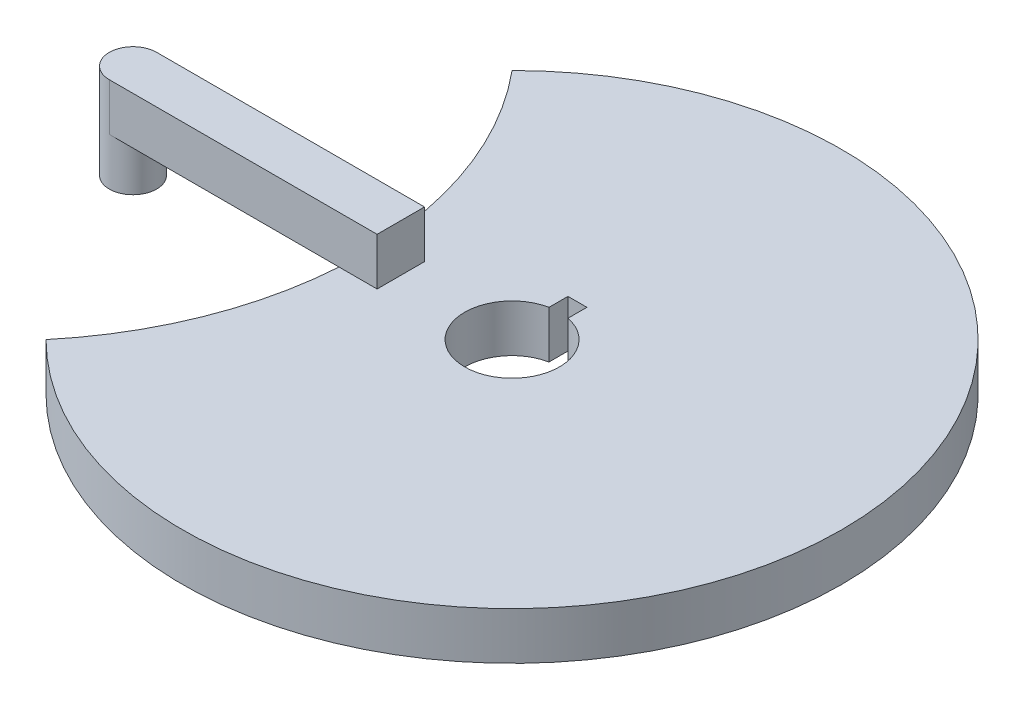
ISO-10303-21;
HEADER;
FILE_DESCRIPTION(('STEP AP214'),'2;1');
FILE_NAME('part.step','',(''),(''),'','','');
FILE_SCHEMA(('AUTOMOTIVE_DESIGN { 1 0 10303 214 1 1 1 1 }'));
ENDSEC;
DATA;
#1=APPLICATION_CONTEXT('core data for automotive mechanical design processes');
#2=APPLICATION_PROTOCOL_DEFINITION('international standard','automotive_design',2000,#1);
#3=PRODUCT_CONTEXT('',#1,'mechanical');
#4=PRODUCT('Part','Part','',(#3));
#5=PRODUCT_RELATED_PRODUCT_CATEGORY('part','',(#4));
#6=PRODUCT_DEFINITION_FORMATION('','',#4);
#7=PRODUCT_DEFINITION_CONTEXT('part definition',#1,'design');
#8=PRODUCT_DEFINITION('design','',#6,#7);
#9=PRODUCT_DEFINITION_SHAPE('','',#8);
#10=(LENGTH_UNIT() NAMED_UNIT(*) SI_UNIT(.MILLI.,.METRE.));
#11=(NAMED_UNIT(*) PLANE_ANGLE_UNIT() SI_UNIT($,.RADIAN.));
#12=(NAMED_UNIT(*) SI_UNIT($,.STERADIAN.) SOLID_ANGLE_UNIT());
#13=UNCERTAINTY_MEASURE_WITH_UNIT(LENGTH_MEASURE(1.E-05),#10,'distance_accuracy_value','');
#14=(GEOMETRIC_REPRESENTATION_CONTEXT(3) GLOBAL_UNCERTAINTY_ASSIGNED_CONTEXT((#13)) GLOBAL_UNIT_ASSIGNED_CONTEXT((#10,
#11,#12)) REPRESENTATION_CONTEXT('',''));
#15=CARTESIAN_POINT('',(0.,0.,0.));
#16=DIRECTION('',(0.,0.,1.));
#17=DIRECTION('',(1.,0.,0.));
#18=AXIS2_PLACEMENT_3D('',#15,#16,#17);
#19=CARTESIAN_POINT('',(-80.,10.,0.));
#20=DIRECTION('',(0.,1.,0.));
#21=DIRECTION('',(0.,0.,1.));
#22=AXIS2_PLACEMENT_3D('',#19,#20,#21);
#23=PLANE('',#22);
#24=CARTESIAN_POINT('',(-80.,10.,0.));
#25=DIRECTION('',(0.,-1.,0.));
#26=DIRECTION('',(0.,0.,-1.));
#27=AXIS2_PLACEMENT_3D('',#24,#25,#26);
#28=CIRCLE('',#27,4.99999999999999);
#29=CARTESIAN_POINT('',(-80.,10.,-5.));
#30=VERTEX_POINT('',#29);
#31=CARTESIAN_POINT('',(-80.,10.,5.));
#32=VERTEX_POINT('',#31);
#33=EDGE_CURVE('E118',#30,#32,#28,.T.);
#34=ORIENTED_EDGE('',*,*,#33,.F.);
#35=DIRECTION('',(-1.,0.,0.));
#36=VECTOR('',#35,1.);
#37=CARTESIAN_POINT('',(-80.,10.,-5.));
#38=LINE('',#37,#36);
#39=CARTESIAN_POINT('',(-31.5206742365615,10.,-5.));
#40=VERTEX_POINT('',#39);
#41=EDGE_CURVE('E121',#40,#30,#38,.T.);
#42=ORIENTED_EDGE('',*,*,#41,.F.);
#43=CARTESIAN_POINT('',(-108.123836132993,10.,0.));
#44=DIRECTION('',(0.,-1.,0.));
#45=DIRECTION('',(0.,0.,1.));
#46=AXIS2_PLACEMENT_3D('',#43,#44,#45);
#47=CIRCLE('',#46,76.7661671085045);
#48=CARTESIAN_POINT('',(-31.5206742365615,10.,5.));
#49=VERTEX_POINT('',#48);
#50=EDGE_CURVE('E190',#40,#49,#47,.T.);
#51=ORIENTED_EDGE('',*,*,#50,.T.);
#52=DIRECTION('',(1.,0.,0.));
#53=VECTOR('',#52,1.);
#54=CARTESIAN_POINT('',(-23.4813388189182,10.,5.));
#55=LINE('',#54,#53);
#56=EDGE_CURVE('E45',#32,#49,#55,.T.);
#57=ORIENTED_EDGE('',*,*,#56,.F.);
#58=EDGE_LOOP('',(#34,#42,#51,#57));
#59=FACE_BOUND('',#58,.T.);
#60=ADVANCED_FACE('F35',(#59),#23,.F.);
#61=CARTESIAN_POINT('',(-54.0619180664963,10.,0.));
#62=DIRECTION('',(0.,1.,0.));
#63=DIRECTION('',(0.,0.,1.));
#64=AXIS2_PLACEMENT_3D('',#61,#62,#63);
#65=PLANE('',#64);
#66=CARTESIAN_POINT('',(-23.4813388189182,10.,-5.));
#67=VERTEX_POINT('',#66);
#68=EDGE_CURVE('E52',#67,#40,#38,.T.);
#69=ORIENTED_EDGE('',*,*,#68,.F.);
#70=DIRECTION('',(0.,0.,-1.));
#71=VECTOR('',#70,1.);
#72=CARTESIAN_POINT('',(-23.4813388189182,10.,-5.));
#73=LINE('',#72,#71);
#74=CARTESIAN_POINT('',(-23.4813388189182,10.,5.));
#75=VERTEX_POINT('',#74);
#76=EDGE_CURVE('E136',#75,#67,#73,.T.);
#77=ORIENTED_EDGE('',*,*,#76,.F.);
#78=EDGE_CURVE('E11',#49,#75,#55,.T.);
#79=ORIENTED_EDGE('',*,*,#78,.F.);
#80=CARTESIAN_POINT('',(-49.1801948833497,10.,49.1801948833496));
#81=VERTEX_POINT('',#80);
#82=EDGE_CURVE('E191',#49,#81,#47,.T.);
#83=ORIENTED_EDGE('',*,*,#82,.T.);
#84=CARTESIAN_POINT('',(0.,10.,0.));
#85=DIRECTION('',(0.,1.,0.));
#86=DIRECTION('',(0.,0.,1.));
#87=AXIS2_PLACEMENT_3D('',#84,#85,#86);
#88=CIRCLE('',#87,69.551298604185);
#89=CARTESIAN_POINT('',(-49.1801948833499,10.,-49.1801948833494));
#90=VERTEX_POINT('',#89);
#91=EDGE_CURVE('E189',#81,#90,#88,.T.);
#92=ORIENTED_EDGE('',*,*,#91,.T.);
#93=EDGE_CURVE('E187',#90,#40,#47,.T.);
#94=ORIENTED_EDGE('',*,*,#93,.T.);
#95=EDGE_LOOP('',(#69,#77,#79,#83,#92,#94));
#96=FACE_BOUND('',#95,.T.);
#97=DIRECTION('',(0.,0.,-1.));
#98=VECTOR('',#97,1.);
#99=CARTESIAN_POINT('',(2.,10.,-9.79795897113271));
#100=LINE('',#99,#98);
#101=CARTESIAN_POINT('',(2.,10.,-9.79795897113271));
#102=VERTEX_POINT('',#101);
#103=CARTESIAN_POINT('',(2.,10.,-13.7979589711327));
#104=VERTEX_POINT('',#103);
#105=EDGE_CURVE('E158',#102,#104,#100,.T.);
#106=ORIENTED_EDGE('',*,*,#105,.F.);
#107=CARTESIAN_POINT('',(0.,10.,0.));
#108=DIRECTION('',(0.,1.,0.));
#109=DIRECTION('',(0.,0.,1.));
#110=AXIS2_PLACEMENT_3D('',#107,#108,#109);
#111=CIRCLE('',#110,10.);
#112=CARTESIAN_POINT('',(-2.,10.,-9.79795897113271));
#113=VERTEX_POINT('',#112);
#114=EDGE_CURVE('E156',#113,#102,#111,.T.);
#115=ORIENTED_EDGE('',*,*,#114,.F.);
#116=DIRECTION('',(0.,0.,1.));
#117=VECTOR('',#116,1.);
#118=CARTESIAN_POINT('',(-2.,10.,-9.79795897113271));
#119=LINE('',#118,#117);
#120=CARTESIAN_POINT('',(-2.,10.,-13.7979589711327));
#121=VERTEX_POINT('',#120);
#122=EDGE_CURVE('E164',#121,#113,#119,.T.);
#123=ORIENTED_EDGE('',*,*,#122,.F.);
#124=DIRECTION('',(-1.,0.,0.));
#125=VECTOR('',#124,1.);
#126=CARTESIAN_POINT('',(-2.,10.,-13.7979589711327));
#127=LINE('',#126,#125);
#128=EDGE_CURVE('E161',#104,#121,#127,.T.);
#129=ORIENTED_EDGE('',*,*,#128,.F.);
#130=EDGE_LOOP('',(#106,#115,#123,#129));
#131=FACE_BOUND('',#130,.T.);
#132=ADVANCED_FACE('F211',(#96,#131),#65,.T.);
#133=CARTESIAN_POINT('',(-54.0619180664963,0.,0.));
#134=DIRECTION('',(0.,1.,0.));
#135=DIRECTION('',(0.,0.,1.));
#136=AXIS2_PLACEMENT_3D('',#133,#134,#135);
#137=PLANE('',#136);
#138=CARTESIAN_POINT('',(-108.123836132993,0.,0.));
#139=DIRECTION('',(0.,-1.,0.));
#140=DIRECTION('',(0.,0.,1.));
#141=AXIS2_PLACEMENT_3D('',#138,#139,#140);
#142=CIRCLE('',#141,76.7661671085045);
#143=CARTESIAN_POINT('',(-49.1801948833499,0.,-49.1801948833494));
#144=VERTEX_POINT('',#143);
#145=CARTESIAN_POINT('',(-49.1801948833497,0.,49.1801948833496));
#146=VERTEX_POINT('',#145);
#147=EDGE_CURVE('E186',#144,#146,#142,.T.);
#148=ORIENTED_EDGE('',*,*,#147,.F.);
#149=CARTESIAN_POINT('',(0.,0.,0.));
#150=DIRECTION('',(0.,1.,0.));
#151=DIRECTION('',(0.,0.,1.));
#152=AXIS2_PLACEMENT_3D('',#149,#150,#151);
#153=CIRCLE('',#152,69.551298604185);
#154=EDGE_CURVE('E196',#146,#144,#153,.T.);
#155=ORIENTED_EDGE('',*,*,#154,.F.);
#156=EDGE_LOOP('',(#148,#155));
#157=FACE_BOUND('',#156,.T.);
#158=CARTESIAN_POINT('',(0.,0.,0.));
#159=DIRECTION('',(0.,1.,0.));
#160=DIRECTION('',(0.,0.,1.));
#161=AXIS2_PLACEMENT_3D('',#158,#159,#160);
#162=CIRCLE('',#161,10.);
#163=CARTESIAN_POINT('',(-2.,0.,-9.79795897113271));
#164=VERTEX_POINT('',#163);
#165=CARTESIAN_POINT('',(2.,0.,-9.79795897113271));
#166=VERTEX_POINT('',#165);
#167=EDGE_CURVE('E155',#164,#166,#162,.T.);
#168=ORIENTED_EDGE('',*,*,#167,.T.);
#169=DIRECTION('',(0.,0.,-1.));
#170=VECTOR('',#169,1.);
#171=CARTESIAN_POINT('',(2.,0.,-9.79795897113271));
#172=LINE('',#171,#170);
#173=CARTESIAN_POINT('',(2.,0.,-13.7979589711327));
#174=VERTEX_POINT('',#173);
#175=EDGE_CURVE('E169',#166,#174,#172,.T.);
#176=ORIENTED_EDGE('',*,*,#175,.T.);
#177=DIRECTION('',(-1.,0.,0.));
#178=VECTOR('',#177,1.);
#179=CARTESIAN_POINT('',(-2.,0.,-13.7979589711327));
#180=LINE('',#179,#178);
#181=CARTESIAN_POINT('',(-2.,0.,-13.7979589711327));
#182=VERTEX_POINT('',#181);
#183=EDGE_CURVE('E172',#174,#182,#180,.T.);
#184=ORIENTED_EDGE('',*,*,#183,.T.);
#185=DIRECTION('',(0.,0.,1.));
#186=VECTOR('',#185,1.);
#187=CARTESIAN_POINT('',(-2.,0.,-9.79795897113271));
#188=LINE('',#187,#186);
#189=EDGE_CURVE('E159',#182,#164,#188,.T.);
#190=ORIENTED_EDGE('',*,*,#189,.T.);
#191=EDGE_LOOP('',(#168,#176,#184,#190));
#192=FACE_BOUND('',#191,.T.);
#193=ADVANCED_FACE('F208',(#157,#192),#137,.F.);
#194=CARTESIAN_POINT('',(-108.123836132993,10.,0.));
#195=DIRECTION('',(0.,-1.,0.));
#196=DIRECTION('',(0.,0.,-1.));
#197=AXIS2_PLACEMENT_3D('',#194,#195,#196);
#198=CYLINDRICAL_SURFACE('',#197,76.7661671085045);
#199=ORIENTED_EDGE('',*,*,#147,.T.);
#200=DIRECTION('',(0.,-1.,0.));
#201=VECTOR('',#200,1.);
#202=CARTESIAN_POINT('',(-49.1801948833497,10.,49.1801948833496));
#203=LINE('',#202,#201);
#204=EDGE_CURVE('E39',#81,#146,#203,.T.);
#205=ORIENTED_EDGE('',*,*,#204,.F.);
#206=ORIENTED_EDGE('',*,*,#82,.F.);
#207=ORIENTED_EDGE('',*,*,#50,.F.);
#208=ORIENTED_EDGE('',*,*,#93,.F.);
#209=DIRECTION('',(0.,-1.,0.));
#210=VECTOR('',#209,1.);
#211=CARTESIAN_POINT('',(-49.1801948833499,10.,-49.1801948833494));
#212=LINE('',#211,#210);
#213=EDGE_CURVE('E193',#90,#144,#212,.T.);
#214=ORIENTED_EDGE('',*,*,#213,.T.);
#215=EDGE_LOOP('',(#199,#205,#206,#207,#208,#214));
#216=FACE_BOUND('',#215,.T.);
#217=ADVANCED_FACE('F37',(#216),#198,.F.);
#218=CARTESIAN_POINT('',(0.,10.,0.));
#219=DIRECTION('',(0.,-1.,0.));
#220=DIRECTION('',(0.,0.,-1.));
#221=AXIS2_PLACEMENT_3D('',#218,#219,#220);
#222=CYLINDRICAL_SURFACE('',#221,69.551298604185);
#223=ORIENTED_EDGE('',*,*,#154,.T.);
#224=ORIENTED_EDGE('',*,*,#213,.F.);
#225=ORIENTED_EDGE('',*,*,#91,.F.);
#226=ORIENTED_EDGE('',*,*,#204,.T.);
#227=EDGE_LOOP('',(#223,#224,#225,#226));
#228=FACE_BOUND('',#227,.T.);
#229=ADVANCED_FACE('F206',(#228),#222,.T.);
#230=CARTESIAN_POINT('',(0.,10.,0.));
#231=DIRECTION('',(0.,-1.,0.));
#232=DIRECTION('',(0.,0.,-1.));
#233=AXIS2_PLACEMENT_3D('',#230,#231,#232);
#234=CYLINDRICAL_SURFACE('',#233,10.);
#235=ORIENTED_EDGE('',*,*,#167,.F.);
#236=DIRECTION('',(0.,-1.,0.));
#237=VECTOR('',#236,1.);
#238=CARTESIAN_POINT('',(-2.,10.,-9.79795897113271));
#239=LINE('',#238,#237);
#240=EDGE_CURVE('E166',#113,#164,#239,.T.);
#241=ORIENTED_EDGE('',*,*,#240,.F.);
#242=ORIENTED_EDGE('',*,*,#114,.T.);
#243=DIRECTION('',(0.,-1.,0.));
#244=VECTOR('',#243,1.);
#245=CARTESIAN_POINT('',(2.,10.,-9.79795897113271));
#246=LINE('',#245,#244);
#247=EDGE_CURVE('E183',#102,#166,#246,.T.);
#248=ORIENTED_EDGE('',*,*,#247,.T.);
#249=EDGE_LOOP('',(#235,#241,#242,#248));
#250=FACE_BOUND('',#249,.T.);
#251=ADVANCED_FACE('F216',(#250),#234,.F.);
#252=CARTESIAN_POINT('',(2.,10.,-9.79795897113271));
#253=DIRECTION('',(-1.,0.,0.));
#254=DIRECTION('',(0.,0.,1.));
#255=AXIS2_PLACEMENT_3D('',#252,#253,#254);
#256=PLANE('',#255);
#257=ORIENTED_EDGE('',*,*,#175,.F.);
#258=ORIENTED_EDGE('',*,*,#247,.F.);
#259=ORIENTED_EDGE('',*,*,#105,.T.);
#260=DIRECTION('',(0.,-1.,0.));
#261=VECTOR('',#260,1.);
#262=CARTESIAN_POINT('',(2.,10.,-13.7979589711327));
#263=LINE('',#262,#261);
#264=EDGE_CURVE('E181',#104,#174,#263,.T.);
#265=ORIENTED_EDGE('',*,*,#264,.T.);
#266=EDGE_LOOP('',(#257,#258,#259,#265));
#267=FACE_BOUND('',#266,.T.);
#268=ADVANCED_FACE('F226',(#267),#256,.T.);
#269=CARTESIAN_POINT('',(-2.,10.,-13.7979589711327));
#270=DIRECTION('',(0.,0.,1.));
#271=DIRECTION('',(1.,0.,0.));
#272=AXIS2_PLACEMENT_3D('',#269,#270,#271);
#273=PLANE('',#272);
#274=ORIENTED_EDGE('',*,*,#183,.F.);
#275=ORIENTED_EDGE('',*,*,#264,.F.);
#276=ORIENTED_EDGE('',*,*,#128,.T.);
#277=DIRECTION('',(0.,-1.,0.));
#278=VECTOR('',#277,1.);
#279=CARTESIAN_POINT('',(-2.,10.,-13.7979589711327));
#280=LINE('',#279,#278);
#281=EDGE_CURVE('E179',#121,#182,#280,.T.);
#282=ORIENTED_EDGE('',*,*,#281,.T.);
#283=EDGE_LOOP('',(#274,#275,#276,#282));
#284=FACE_BOUND('',#283,.T.);
#285=ADVANCED_FACE('F230',(#284),#273,.T.);
#286=CARTESIAN_POINT('',(-2.,10.,-9.79795897113271));
#287=DIRECTION('',(1.,0.,0.));
#288=DIRECTION('',(0.,0.,-1.));
#289=AXIS2_PLACEMENT_3D('',#286,#287,#288);
#290=PLANE('',#289);
#291=ORIENTED_EDGE('',*,*,#189,.F.);
#292=ORIENTED_EDGE('',*,*,#281,.F.);
#293=ORIENTED_EDGE('',*,*,#122,.T.);
#294=ORIENTED_EDGE('',*,*,#240,.T.);
#295=EDGE_LOOP('',(#291,#292,#293,#294));
#296=FACE_BOUND('',#295,.T.);
#297=ADVANCED_FACE('F220',(#296),#290,.T.);
#298=CARTESIAN_POINT('',(-80.,20.,0.));
#299=DIRECTION('',(0.,-1.,0.));
#300=DIRECTION('',(0.,0.,-1.));
#301=AXIS2_PLACEMENT_3D('',#298,#299,#300);
#302=CYLINDRICAL_SURFACE('',#301,5.);
#303=DIRECTION('',(0.,-1.,0.));
#304=VECTOR('',#303,1.);
#305=CARTESIAN_POINT('',(-80.,20.,-5.));
#306=LINE('',#305,#304);
#307=CARTESIAN_POINT('',(-80.,20.,-5.));
#308=VERTEX_POINT('',#307);
#309=EDGE_CURVE('E133',#308,#30,#306,.T.);
#310=ORIENTED_EDGE('',*,*,#309,.T.);
#311=ORIENTED_EDGE('',*,*,#33,.T.);
#312=DIRECTION('',(0.,-1.,0.));
#313=VECTOR('',#312,1.);
#314=CARTESIAN_POINT('',(-80.,20.,5.));
#315=LINE('',#314,#313);
#316=CARTESIAN_POINT('',(-80.,20.,5.));
#317=VERTEX_POINT('',#316);
#318=EDGE_CURVE('E153',#317,#32,#315,.T.);
#319=ORIENTED_EDGE('',*,*,#318,.F.);
#320=CARTESIAN_POINT('',(-80.,20.,0.));
#321=DIRECTION('',(0.,1.,0.));
#322=DIRECTION('',(0.,0.,1.));
#323=AXIS2_PLACEMENT_3D('',#320,#321,#322);
#324=CIRCLE('',#323,5.);
#325=EDGE_CURVE('E141',#308,#317,#324,.T.);
#326=ORIENTED_EDGE('',*,*,#325,.F.);
#327=EDGE_LOOP('',(#310,#311,#319,#326));
#328=FACE_BOUND('',#327,.T.);
#329=CARTESIAN_POINT('',(-80.,0.,0.));
#330=DIRECTION('',(0.,-1.,0.));
#331=DIRECTION('',(0.,0.,-1.));
#332=AXIS2_PLACEMENT_3D('',#329,#330,#331);
#333=CIRCLE('',#332,4.99999999999999);
#334=CARTESIAN_POINT('',(-80.,0.,-4.99999999999999));
#335=VERTEX_POINT('',#334);
#336=EDGE_CURVE('E127',#335,#335,#333,.T.);
#337=ORIENTED_EDGE('',*,*,#336,.F.);
#338=EDGE_LOOP('',(#337));
#339=FACE_BOUND('',#338,.T.);
#340=ADVANCED_FACE('F138',(#328,#339),#302,.T.);
#341=CARTESIAN_POINT('',(-23.4813388189182,20.,5.));
#342=DIRECTION('',(0.,0.,-1.));
#343=DIRECTION('',(-1.,0.,0.));
#344=AXIS2_PLACEMENT_3D('',#341,#342,#343);
#345=PLANE('',#344);
#346=ORIENTED_EDGE('',*,*,#56,.T.);
#347=ORIENTED_EDGE('',*,*,#78,.T.);
#348=DIRECTION('',(0.,-1.,0.));
#349=VECTOR('',#348,1.);
#350=CARTESIAN_POINT('',(-23.4813388189182,20.,5.));
#351=LINE('',#350,#349);
#352=CARTESIAN_POINT('',(-23.4813388189182,20.,5.));
#353=VERTEX_POINT('',#352);
#354=EDGE_CURVE('E145',#353,#75,#351,.T.);
#355=ORIENTED_EDGE('',*,*,#354,.F.);
#356=DIRECTION('',(1.,0.,0.));
#357=VECTOR('',#356,1.);
#358=CARTESIAN_POINT('',(-23.4813388189182,20.,5.));
#359=LINE('',#358,#357);
#360=EDGE_CURVE('E363',#317,#353,#359,.T.);
#361=ORIENTED_EDGE('',*,*,#360,.F.);
#362=ORIENTED_EDGE('',*,*,#318,.T.);
#363=EDGE_LOOP('',(#346,#347,#355,#361,#362));
#364=FACE_BOUND('',#363,.T.);
#365=ADVANCED_FACE('F254',(#364),#345,.F.);
#366=CARTESIAN_POINT('',(-23.4813388189182,20.,-5.));
#367=DIRECTION('',(-1.,0.,0.));
#368=DIRECTION('',(0.,0.,1.));
#369=AXIS2_PLACEMENT_3D('',#366,#367,#368);
#370=PLANE('',#369);
#371=ORIENTED_EDGE('',*,*,#76,.T.);
#372=DIRECTION('',(0.,-1.,0.));
#373=VECTOR('',#372,1.);
#374=CARTESIAN_POINT('',(-23.4813388189182,20.,-5.));
#375=LINE('',#374,#373);
#376=CARTESIAN_POINT('',(-23.4813388189182,20.,-5.));
#377=VERTEX_POINT('',#376);
#378=EDGE_CURVE('E142',#377,#67,#375,.T.);
#379=ORIENTED_EDGE('',*,*,#378,.F.);
#380=DIRECTION('',(0.,0.,-1.));
#381=VECTOR('',#380,1.);
#382=CARTESIAN_POINT('',(-23.4813388189182,20.,-5.));
#383=LINE('',#382,#381);
#384=EDGE_CURVE('E147',#353,#377,#383,.T.);
#385=ORIENTED_EDGE('',*,*,#384,.F.);
#386=ORIENTED_EDGE('',*,*,#354,.T.);
#387=EDGE_LOOP('',(#371,#379,#385,#386));
#388=FACE_BOUND('',#387,.T.);
#389=ADVANCED_FACE('F251',(#388),#370,.F.);
#390=CARTESIAN_POINT('',(-80.,20.,-5.));
#391=DIRECTION('',(0.,0.,1.));
#392=DIRECTION('',(1.,0.,0.));
#393=AXIS2_PLACEMENT_3D('',#390,#391,#392);
#394=PLANE('',#393);
#395=ORIENTED_EDGE('',*,*,#68,.T.);
#396=ORIENTED_EDGE('',*,*,#41,.T.);
#397=ORIENTED_EDGE('',*,*,#309,.F.);
#398=DIRECTION('',(-1.,0.,0.));
#399=VECTOR('',#398,1.);
#400=CARTESIAN_POINT('',(-80.,20.,-5.));
#401=LINE('',#400,#399);
#402=EDGE_CURVE('E143',#377,#308,#401,.T.);
#403=ORIENTED_EDGE('',*,*,#402,.F.);
#404=ORIENTED_EDGE('',*,*,#378,.T.);
#405=EDGE_LOOP('',(#395,#396,#397,#403,#404));
#406=FACE_BOUND('',#405,.T.);
#407=ADVANCED_FACE('F131',(#406),#394,.F.);
#408=CARTESIAN_POINT('',(-80.,20.,0.));
#409=DIRECTION('',(0.,1.,0.));
#410=DIRECTION('',(0.,0.,1.));
#411=AXIS2_PLACEMENT_3D('',#408,#409,#410);
#412=PLANE('',#411);
#413=ORIENTED_EDGE('',*,*,#325,.T.);
#414=ORIENTED_EDGE('',*,*,#360,.T.);
#415=ORIENTED_EDGE('',*,*,#384,.T.);
#416=ORIENTED_EDGE('',*,*,#402,.T.);
#417=EDGE_LOOP('',(#413,#414,#415,#416));
#418=FACE_BOUND('',#417,.T.);
#419=ADVANCED_FACE('F247',(#418),#412,.T.);
#420=CARTESIAN_POINT('',(-80.,0.,0.));
#421=DIRECTION('',(0.,-1.,0.));
#422=DIRECTION('',(0.,0.,-1.));
#423=AXIS2_PLACEMENT_3D('',#420,#421,#422);
#424=PLANE('',#423);
#425=ORIENTED_EDGE('',*,*,#336,.T.);
#426=EDGE_LOOP('',(#425));
#427=FACE_BOUND('',#426,.T.);
#428=ADVANCED_FACE('F284',(#427),#424,.T.);
#429=CLOSED_SHELL('',(#60,#132,#193,#217,#229,#251,#268,#285,#297,#340,#365,#389,#407,#419,#428));
#430=MANIFOLD_SOLID_BREP('B2',#429);
#431=ADVANCED_BREP_SHAPE_REPRESENTATION('',(#18,#430),#14);
#432=SHAPE_DEFINITION_REPRESENTATION(#9,#431);
ENDSEC;
END-ISO-10303-21;
